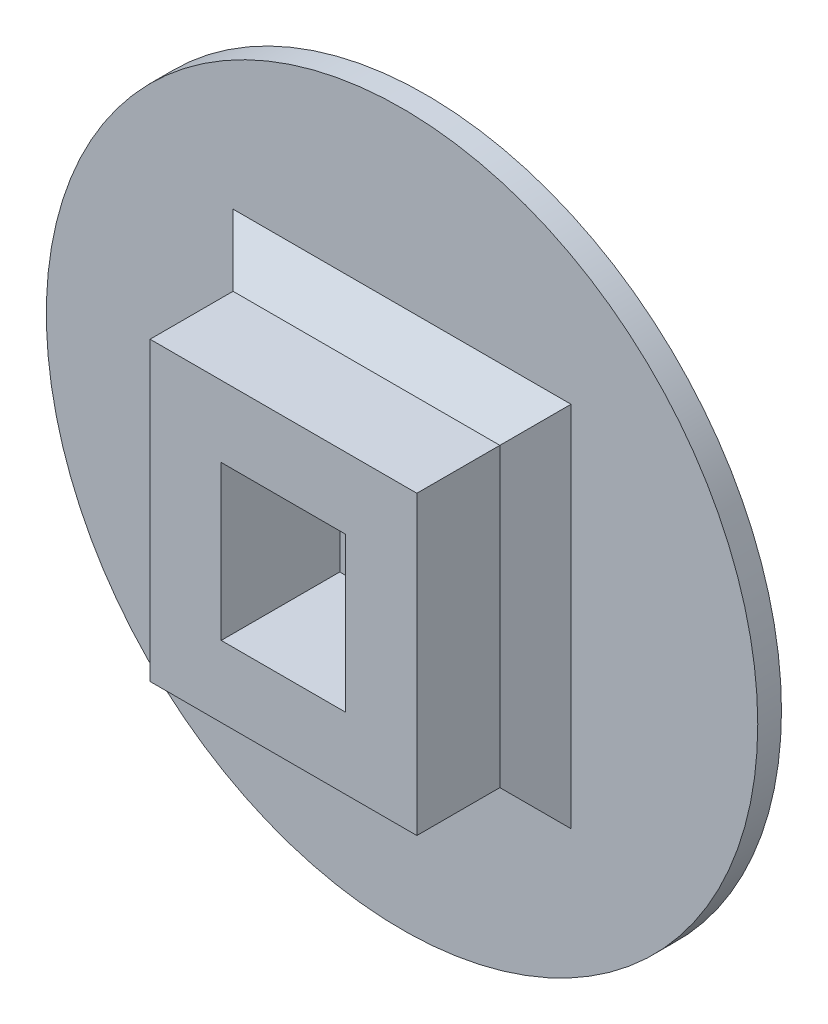
ISO-10303-21;
HEADER;
FILE_DESCRIPTION(('STEP AP214'),'2;1');
FILE_NAME('part.step','',(''),(''),'','','');
FILE_SCHEMA(('AUTOMOTIVE_DESIGN { 1 0 10303 214 1 1 1 1 }'));
ENDSEC;
DATA;
#1=APPLICATION_CONTEXT('core data for automotive mechanical design processes');
#2=APPLICATION_PROTOCOL_DEFINITION('international standard','automotive_design',2000,#1);
#3=PRODUCT_CONTEXT('',#1,'mechanical');
#4=PRODUCT('Part','Part','',(#3));
#5=PRODUCT_RELATED_PRODUCT_CATEGORY('part','',(#4));
#6=PRODUCT_DEFINITION_FORMATION('','',#4);
#7=PRODUCT_DEFINITION_CONTEXT('part definition',#1,'design');
#8=PRODUCT_DEFINITION('design','',#6,#7);
#9=PRODUCT_DEFINITION_SHAPE('','',#8);
#10=(LENGTH_UNIT() NAMED_UNIT(*) SI_UNIT(.MILLI.,.METRE.));
#11=(NAMED_UNIT(*) PLANE_ANGLE_UNIT() SI_UNIT($,.RADIAN.));
#12=(NAMED_UNIT(*) SI_UNIT($,.STERADIAN.) SOLID_ANGLE_UNIT());
#13=UNCERTAINTY_MEASURE_WITH_UNIT(LENGTH_MEASURE(1.E-05),#10,'distance_accuracy_value','');
#14=(GEOMETRIC_REPRESENTATION_CONTEXT(3) GLOBAL_UNCERTAINTY_ASSIGNED_CONTEXT((#13)) GLOBAL_UNIT_ASSIGNED_CONTEXT((#10,
#11,#12)) REPRESENTATION_CONTEXT('',''));
#15=CARTESIAN_POINT('',(0.,0.,0.));
#16=DIRECTION('',(0.,0.,1.));
#17=DIRECTION('',(1.,0.,0.));
#18=AXIS2_PLACEMENT_3D('',#15,#16,#17);
#19=CARTESIAN_POINT('',(0.,0.,0.4));
#20=DIRECTION('',(0.,0.,1.));
#21=DIRECTION('',(1.,0.,0.));
#22=AXIS2_PLACEMENT_3D('',#19,#20,#21);
#23=PLANE('',#22);
#24=DIRECTION('',(0.,-1.,0.));
#25=VECTOR('',#24,1.);
#26=CARTESIAN_POINT('',(2.85,0.,0.4));
#27=LINE('',#26,#25);
#28=CARTESIAN_POINT('',(2.85,3.1,0.4));
#29=VERTEX_POINT('',#28);
#30=CARTESIAN_POINT('',(2.85,-3.1,0.4));
#31=VERTEX_POINT('',#30);
#32=EDGE_CURVE('E209',#29,#31,#27,.T.);
#33=ORIENTED_EDGE('',*,*,#32,.T.);
#34=DIRECTION('',(-1.,0.,0.));
#35=VECTOR('',#34,1.);
#36=CARTESIAN_POINT('',(0.,-3.1,0.4));
#37=LINE('',#36,#35);
#38=CARTESIAN_POINT('',(-2.85,-3.1,0.4));
#39=VERTEX_POINT('',#38);
#40=EDGE_CURVE('E213',#31,#39,#37,.T.);
#41=ORIENTED_EDGE('',*,*,#40,.T.);
#42=DIRECTION('',(0.,1.,0.));
#43=VECTOR('',#42,1.);
#44=CARTESIAN_POINT('',(-2.85,0.,0.4));
#45=LINE('',#44,#43);
#46=CARTESIAN_POINT('',(-2.85,3.1,0.4));
#47=VERTEX_POINT('',#46);
#48=EDGE_CURVE('E211',#39,#47,#45,.T.);
#49=ORIENTED_EDGE('',*,*,#48,.T.);
#50=DIRECTION('',(1.,0.,0.));
#51=VECTOR('',#50,1.);
#52=CARTESIAN_POINT('',(0.,3.1,0.4));
#53=LINE('',#52,#51);
#54=EDGE_CURVE('E207',#47,#29,#53,.T.);
#55=ORIENTED_EDGE('',*,*,#54,.T.);
#56=EDGE_LOOP('',(#33,#41,#49,#55));
#57=FACE_BOUND('',#56,.T.);
#58=CARTESIAN_POINT('',(0.,0.,0.4));
#59=DIRECTION('',(0.,0.,1.));
#60=DIRECTION('',(1.,0.,0.));
#61=AXIS2_PLACEMENT_3D('',#58,#59,#60);
#62=CIRCLE('',#61,6.);
#63=CARTESIAN_POINT('',(6.,0.,0.4));
#64=VERTEX_POINT('',#63);
#65=EDGE_CURVE('E199',#64,#64,#62,.T.);
#66=ORIENTED_EDGE('',*,*,#65,.T.);
#67=EDGE_LOOP('',(#66));
#68=FACE_BOUND('',#67,.T.);
#69=ADVANCED_FACE('F58',(#57,#68),#23,.T.);
#70=CARTESIAN_POINT('',(0.,0.,0.4));
#71=DIRECTION('',(0.,0.,-1.));
#72=DIRECTION('',(-1.,0.,0.));
#73=AXIS2_PLACEMENT_3D('',#70,#71,#72);
#74=CYLINDRICAL_SURFACE('',#73,6.);
#75=ORIENTED_EDGE('',*,*,#65,.F.);
#76=EDGE_LOOP('',(#75));
#77=FACE_BOUND('',#76,.T.);
#78=CARTESIAN_POINT('',(0.,0.,0.));
#79=DIRECTION('',(0.,0.,1.));
#80=DIRECTION('',(1.,0.,0.));
#81=AXIS2_PLACEMENT_3D('',#78,#79,#80);
#82=CIRCLE('',#81,6.);
#83=CARTESIAN_POINT('',(6.,0.,0.));
#84=VERTEX_POINT('',#83);
#85=EDGE_CURVE('E198',#84,#84,#82,.T.);
#86=ORIENTED_EDGE('',*,*,#85,.T.);
#87=EDGE_LOOP('',(#86));
#88=FACE_BOUND('',#87,.T.);
#89=ADVANCED_FACE('F265',(#77,#88),#74,.T.);
#90=CARTESIAN_POINT('',(0.,0.,9.1));
#91=DIRECTION('',(0.,0.,1.));
#92=DIRECTION('',(1.,0.,0.));
#93=AXIS2_PLACEMENT_3D('',#90,#91,#92);
#94=SPHERICAL_SURFACE('',#93,10.9);
#95=ORIENTED_EDGE('',*,*,#85,.F.);
#96=EDGE_LOOP('',(#95));
#97=FACE_BOUND('',#96,.T.);
#98=ADVANCED_FACE('F271',(#97),#94,.T.);
#99=CARTESIAN_POINT('',(0.,0.,2.4));
#100=DIRECTION('',(0.,0.,1.));
#101=DIRECTION('',(1.,0.,0.));
#102=AXIS2_PLACEMENT_3D('',#99,#100,#101);
#103=PLANE('',#102);
#104=DIRECTION('',(0.,1.,0.));
#105=VECTOR('',#104,1.);
#106=CARTESIAN_POINT('',(2.25,1.3,2.4));
#107=LINE('',#106,#105);
#108=CARTESIAN_POINT('',(2.25,-2.5,2.4));
#109=VERTEX_POINT('',#108);
#110=CARTESIAN_POINT('',(2.25,2.5,2.4));
#111=VERTEX_POINT('',#110);
#112=EDGE_CURVE('E158',#109,#111,#107,.T.);
#113=ORIENTED_EDGE('',*,*,#112,.T.);
#114=DIRECTION('',(-1.,0.,0.));
#115=VECTOR('',#114,1.);
#116=CARTESIAN_POINT('',(-1.05,2.5,2.4));
#117=LINE('',#116,#115);
#118=CARTESIAN_POINT('',(-2.25,2.5,2.4));
#119=VERTEX_POINT('',#118);
#120=EDGE_CURVE('E183',#111,#119,#117,.T.);
#121=ORIENTED_EDGE('',*,*,#120,.T.);
#122=DIRECTION('',(0.,-1.,0.));
#123=VECTOR('',#122,1.);
#124=CARTESIAN_POINT('',(-2.25,1.3,2.4));
#125=LINE('',#124,#123);
#126=CARTESIAN_POINT('',(-2.25,-2.5,2.4));
#127=VERTEX_POINT('',#126);
#128=EDGE_CURVE('E185',#119,#127,#125,.T.);
#129=ORIENTED_EDGE('',*,*,#128,.T.);
#130=DIRECTION('',(1.,0.,0.));
#131=VECTOR('',#130,1.);
#132=CARTESIAN_POINT('',(-1.05,-2.5,2.4));
#133=LINE('',#132,#131);
#134=EDGE_CURVE('E187',#127,#109,#133,.T.);
#135=ORIENTED_EDGE('',*,*,#134,.T.);
#136=EDGE_LOOP('',(#113,#121,#129,#135));
#137=FACE_BOUND('',#136,.T.);
#138=DIRECTION('',(-1.,0.,0.));
#139=VECTOR('',#138,1.);
#140=CARTESIAN_POINT('',(-1.05,1.3,2.4));
#141=LINE('',#140,#139);
#142=CARTESIAN_POINT('',(1.05,1.3,2.4));
#143=VERTEX_POINT('',#142);
#144=CARTESIAN_POINT('',(-1.05,1.3,2.4));
#145=VERTEX_POINT('',#144);
#146=EDGE_CURVE('E149',#143,#145,#141,.T.);
#147=ORIENTED_EDGE('',*,*,#146,.F.);
#148=DIRECTION('',(0.,1.,0.));
#149=VECTOR('',#148,1.);
#150=CARTESIAN_POINT('',(1.05,1.3,2.4));
#151=LINE('',#150,#149);
#152=CARTESIAN_POINT('',(1.05,-1.3,2.4));
#153=VERTEX_POINT('',#152);
#154=EDGE_CURVE('E139',#153,#143,#151,.T.);
#155=ORIENTED_EDGE('',*,*,#154,.F.);
#156=DIRECTION('',(1.,0.,0.));
#157=VECTOR('',#156,1.);
#158=CARTESIAN_POINT('',(-1.05,-1.3,2.4));
#159=LINE('',#158,#157);
#160=CARTESIAN_POINT('',(-1.05,-1.3,2.4));
#161=VERTEX_POINT('',#160);
#162=EDGE_CURVE('E166',#161,#153,#159,.T.);
#163=ORIENTED_EDGE('',*,*,#162,.F.);
#164=DIRECTION('',(0.,-1.,0.));
#165=VECTOR('',#164,1.);
#166=CARTESIAN_POINT('',(-1.05,1.3,2.4));
#167=LINE('',#166,#165);
#168=EDGE_CURVE('E164',#145,#161,#167,.T.);
#169=ORIENTED_EDGE('',*,*,#168,.F.);
#170=EDGE_LOOP('',(#147,#155,#163,#169));
#171=FACE_BOUND('',#170,.T.);
#172=ADVANCED_FACE('F162',(#137,#171),#103,.T.);
#173=CARTESIAN_POINT('',(2.25,1.3,2.4));
#174=DIRECTION('',(-1.,0.,0.));
#175=DIRECTION('',(0.,-1.,0.));
#176=AXIS2_PLACEMENT_3D('',#173,#174,#175);
#177=PLANE('',#176);
#178=DIRECTION('',(0.,0.,-1.));
#179=VECTOR('',#178,1.);
#180=CARTESIAN_POINT('',(2.25,-2.5,2.4));
#181=LINE('',#180,#179);
#182=CARTESIAN_POINT('',(2.25,-2.5,1.));
#183=VERTEX_POINT('',#182);
#184=EDGE_CURVE('E189',#109,#183,#181,.T.);
#185=ORIENTED_EDGE('',*,*,#184,.T.);
#186=DIRECTION('',(0.,1.,0.));
#187=VECTOR('',#186,1.);
#188=CARTESIAN_POINT('',(2.25,1.3,1.));
#189=LINE('',#188,#187);
#190=CARTESIAN_POINT('',(2.25,2.5,1.));
#191=VERTEX_POINT('',#190);
#192=EDGE_CURVE('E68',#183,#191,#189,.T.);
#193=ORIENTED_EDGE('',*,*,#192,.T.);
#194=DIRECTION('',(0.,0.,-1.));
#195=VECTOR('',#194,1.);
#196=CARTESIAN_POINT('',(2.25,2.5,2.4));
#197=LINE('',#196,#195);
#198=EDGE_CURVE('E196',#111,#191,#197,.T.);
#199=ORIENTED_EDGE('',*,*,#198,.F.);
#200=ORIENTED_EDGE('',*,*,#112,.F.);
#201=EDGE_LOOP('',(#185,#193,#199,#200));
#202=FACE_BOUND('',#201,.T.);
#203=ADVANCED_FACE('F250',(#202),#177,.F.);
#204=CARTESIAN_POINT('',(-1.05,2.5,2.4));
#205=DIRECTION('',(0.,-1.,0.));
#206=DIRECTION('',(0.,0.,-1.));
#207=AXIS2_PLACEMENT_3D('',#204,#205,#206);
#208=PLANE('',#207);
#209=ORIENTED_EDGE('',*,*,#198,.T.);
#210=DIRECTION('',(-1.,0.,0.));
#211=VECTOR('',#210,1.);
#212=CARTESIAN_POINT('',(-1.05,2.5,1.));
#213=LINE('',#212,#211);
#214=CARTESIAN_POINT('',(-2.25,2.5,1.));
#215=VERTEX_POINT('',#214);
#216=EDGE_CURVE('E12',#191,#215,#213,.T.);
#217=ORIENTED_EDGE('',*,*,#216,.T.);
#218=DIRECTION('',(0.,0.,-1.));
#219=VECTOR('',#218,1.);
#220=CARTESIAN_POINT('',(-2.25,2.5,2.4));
#221=LINE('',#220,#219);
#222=EDGE_CURVE('E194',#119,#215,#221,.T.);
#223=ORIENTED_EDGE('',*,*,#222,.F.);
#224=ORIENTED_EDGE('',*,*,#120,.F.);
#225=EDGE_LOOP('',(#209,#217,#223,#224));
#226=FACE_BOUND('',#225,.T.);
#227=ADVANCED_FACE('F255',(#226),#208,.F.);
#228=CARTESIAN_POINT('',(-2.25,1.3,2.4));
#229=DIRECTION('',(1.,0.,0.));
#230=DIRECTION('',(0.,1.,0.));
#231=AXIS2_PLACEMENT_3D('',#228,#229,#230);
#232=PLANE('',#231);
#233=ORIENTED_EDGE('',*,*,#222,.T.);
#234=DIRECTION('',(0.,-1.,0.));
#235=VECTOR('',#234,1.);
#236=CARTESIAN_POINT('',(-2.25,1.3,1.));
#237=LINE('',#236,#235);
#238=CARTESIAN_POINT('',(-2.25,-2.5,1.));
#239=VERTEX_POINT('',#238);
#240=EDGE_CURVE('E216',#215,#239,#237,.T.);
#241=ORIENTED_EDGE('',*,*,#240,.T.);
#242=DIRECTION('',(0.,0.,-1.));
#243=VECTOR('',#242,1.);
#244=CARTESIAN_POINT('',(-2.25,-2.5,2.4));
#245=LINE('',#244,#243);
#246=EDGE_CURVE('E191',#127,#239,#245,.T.);
#247=ORIENTED_EDGE('',*,*,#246,.F.);
#248=ORIENTED_EDGE('',*,*,#128,.F.);
#249=EDGE_LOOP('',(#233,#241,#247,#248));
#250=FACE_BOUND('',#249,.T.);
#251=ADVANCED_FACE('F254',(#250),#232,.F.);
#252=CARTESIAN_POINT('',(-1.05,-2.5,2.4));
#253=DIRECTION('',(0.,1.,0.));
#254=DIRECTION('',(0.,0.,1.));
#255=AXIS2_PLACEMENT_3D('',#252,#253,#254);
#256=PLANE('',#255);
#257=ORIENTED_EDGE('',*,*,#246,.T.);
#258=DIRECTION('',(1.,0.,0.));
#259=VECTOR('',#258,1.);
#260=CARTESIAN_POINT('',(-1.05,-2.5,1.));
#261=LINE('',#260,#259);
#262=EDGE_CURVE('E202',#239,#183,#261,.T.);
#263=ORIENTED_EDGE('',*,*,#262,.T.);
#264=ORIENTED_EDGE('',*,*,#184,.F.);
#265=ORIENTED_EDGE('',*,*,#134,.F.);
#266=EDGE_LOOP('',(#257,#263,#264,#265));
#267=FACE_BOUND('',#266,.T.);
#268=ADVANCED_FACE('F246',(#267),#256,.F.);
#269=CARTESIAN_POINT('',(1.05,1.3,2.4));
#270=DIRECTION('',(-1.,0.,0.));
#271=DIRECTION('',(0.,-1.,0.));
#272=AXIS2_PLACEMENT_3D('',#269,#270,#271);
#273=PLANE('',#272);
#274=DIRECTION('',(0.,1.,0.));
#275=VECTOR('',#274,1.);
#276=CARTESIAN_POINT('',(1.05,1.3,0.4));
#277=LINE('',#276,#275);
#278=CARTESIAN_POINT('',(1.05,-1.3,0.4));
#279=VERTEX_POINT('',#278);
#280=CARTESIAN_POINT('',(1.05,1.3,0.4));
#281=VERTEX_POINT('',#280);
#282=EDGE_CURVE('E170',#279,#281,#277,.T.);
#283=ORIENTED_EDGE('',*,*,#282,.F.);
#284=DIRECTION('',(0.,0.,-1.));
#285=VECTOR('',#284,1.);
#286=CARTESIAN_POINT('',(1.05,-1.3,2.4));
#287=LINE('',#286,#285);
#288=EDGE_CURVE('E145',#153,#279,#287,.T.);
#289=ORIENTED_EDGE('',*,*,#288,.F.);
#290=ORIENTED_EDGE('',*,*,#154,.T.);
#291=DIRECTION('',(0.,0.,-1.));
#292=VECTOR('',#291,1.);
#293=CARTESIAN_POINT('',(1.05,1.3,2.4));
#294=LINE('',#293,#292);
#295=EDGE_CURVE('E143',#143,#281,#294,.T.);
#296=ORIENTED_EDGE('',*,*,#295,.T.);
#297=EDGE_LOOP('',(#283,#289,#290,#296));
#298=FACE_BOUND('',#297,.T.);
#299=ADVANCED_FACE('F142',(#298),#273,.T.);
#300=CARTESIAN_POINT('',(-1.05,1.3,2.4));
#301=DIRECTION('',(0.,-1.,0.));
#302=DIRECTION('',(0.,0.,-1.));
#303=AXIS2_PLACEMENT_3D('',#300,#301,#302);
#304=PLANE('',#303);
#305=DIRECTION('',(-1.,0.,0.));
#306=VECTOR('',#305,1.);
#307=CARTESIAN_POINT('',(-1.05,1.3,0.4));
#308=LINE('',#307,#306);
#309=CARTESIAN_POINT('',(-1.05,1.3,0.4));
#310=VERTEX_POINT('',#309);
#311=EDGE_CURVE('E157',#281,#310,#308,.T.);
#312=ORIENTED_EDGE('',*,*,#311,.F.);
#313=ORIENTED_EDGE('',*,*,#295,.F.);
#314=ORIENTED_EDGE('',*,*,#146,.T.);
#315=DIRECTION('',(0.,0.,-1.));
#316=VECTOR('',#315,1.);
#317=CARTESIAN_POINT('',(-1.05,1.3,2.4));
#318=LINE('',#317,#316);
#319=EDGE_CURVE('E159',#145,#310,#318,.T.);
#320=ORIENTED_EDGE('',*,*,#319,.T.);
#321=EDGE_LOOP('',(#312,#313,#314,#320));
#322=FACE_BOUND('',#321,.T.);
#323=ADVANCED_FACE('F154',(#322),#304,.T.);
#324=CARTESIAN_POINT('',(-1.05,1.3,2.4));
#325=DIRECTION('',(1.,0.,0.));
#326=DIRECTION('',(0.,1.,0.));
#327=AXIS2_PLACEMENT_3D('',#324,#325,#326);
#328=PLANE('',#327);
#329=DIRECTION('',(0.,-1.,0.));
#330=VECTOR('',#329,1.);
#331=CARTESIAN_POINT('',(-1.05,1.3,0.4));
#332=LINE('',#331,#330);
#333=CARTESIAN_POINT('',(-1.05,-1.3,0.4));
#334=VERTEX_POINT('',#333);
#335=EDGE_CURVE('E173',#310,#334,#332,.T.);
#336=ORIENTED_EDGE('',*,*,#335,.F.);
#337=ORIENTED_EDGE('',*,*,#319,.F.);
#338=ORIENTED_EDGE('',*,*,#168,.T.);
#339=DIRECTION('',(0.,0.,-1.));
#340=VECTOR('',#339,1.);
#341=CARTESIAN_POINT('',(-1.05,-1.3,2.4));
#342=LINE('',#341,#340);
#343=EDGE_CURVE('E177',#161,#334,#342,.T.);
#344=ORIENTED_EDGE('',*,*,#343,.T.);
#345=EDGE_LOOP('',(#336,#337,#338,#344));
#346=FACE_BOUND('',#345,.T.);
#347=ADVANCED_FACE('F281',(#346),#328,.T.);
#348=CARTESIAN_POINT('',(-1.05,-1.3,2.4));
#349=DIRECTION('',(0.,1.,0.));
#350=DIRECTION('',(0.,0.,1.));
#351=AXIS2_PLACEMENT_3D('',#348,#349,#350);
#352=PLANE('',#351);
#353=DIRECTION('',(1.,0.,0.));
#354=VECTOR('',#353,1.);
#355=CARTESIAN_POINT('',(-1.05,-1.3,0.4));
#356=LINE('',#355,#354);
#357=EDGE_CURVE('E150',#334,#279,#356,.T.);
#358=ORIENTED_EDGE('',*,*,#357,.F.);
#359=ORIENTED_EDGE('',*,*,#343,.F.);
#360=ORIENTED_EDGE('',*,*,#162,.T.);
#361=ORIENTED_EDGE('',*,*,#288,.T.);
#362=EDGE_LOOP('',(#358,#359,#360,#361));
#363=FACE_BOUND('',#362,.T.);
#364=ADVANCED_FACE('F275',(#363),#352,.T.);
#365=ORIENTED_EDGE('',*,*,#282,.T.);
#366=ORIENTED_EDGE('',*,*,#311,.T.);
#367=ORIENTED_EDGE('',*,*,#335,.T.);
#368=ORIENTED_EDGE('',*,*,#357,.T.);
#369=EDGE_LOOP('',(#365,#366,#367,#368));
#370=FACE_BOUND('',#369,.T.);
#371=ADVANCED_FACE('F267',(#370),#23,.T.);
#372=CARTESIAN_POINT('',(-1.05,2.5,1.));
#373=DIRECTION('',(0.,-0.707106781186551,-0.707106781186544));
#374=DIRECTION('',(-1.,0.,0.));
#375=AXIS2_PLACEMENT_3D('',#372,#373,#374);
#376=PLANE('',#375);
#377=DIRECTION('',(0.577350269189624,0.577350269189624,-0.577350269189629));
#378=VECTOR('',#377,1.);
#379=CARTESIAN_POINT('',(1.15000000000001,1.40000000000001,2.10000000000001));
#380=LINE('',#379,#378);
#381=EDGE_CURVE('E222',#29,#191,#380,.F.);
#382=ORIENTED_EDGE('',*,*,#381,.F.);
#383=ORIENTED_EDGE('',*,*,#54,.F.);
#384=DIRECTION('',(0.577350269189624,-0.577350269189624,0.577350269189629));
#385=VECTOR('',#384,1.);
#386=CARTESIAN_POINT('',(-1.85,2.1,1.4));
#387=LINE('',#386,#385);
#388=EDGE_CURVE('E63',#215,#47,#387,.F.);
#389=ORIENTED_EDGE('',*,*,#388,.F.);
#390=ORIENTED_EDGE('',*,*,#216,.F.);
#391=EDGE_LOOP('',(#382,#383,#389,#390));
#392=FACE_BOUND('',#391,.T.);
#393=ADVANCED_FACE('F61',(#392),#376,.F.);
#394=CARTESIAN_POINT('',(-2.25,1.3,1.));
#395=DIRECTION('',(0.70710678118655,0.,-0.707106781186544));
#396=DIRECTION('',(0.,-1.,0.));
#397=AXIS2_PLACEMENT_3D('',#394,#395,#396);
#398=PLANE('',#397);
#399=ORIENTED_EDGE('',*,*,#388,.T.);
#400=ORIENTED_EDGE('',*,*,#48,.F.);
#401=DIRECTION('',(0.577350269189624,0.577350269189624,0.577350269189629));
#402=VECTOR('',#401,1.);
#403=CARTESIAN_POINT('',(-0.983333333333341,-1.23333333333334,2.26666666666667));
#404=LINE('',#403,#402);
#405=EDGE_CURVE('E221',#239,#39,#404,.F.);
#406=ORIENTED_EDGE('',*,*,#405,.F.);
#407=ORIENTED_EDGE('',*,*,#240,.F.);
#408=EDGE_LOOP('',(#399,#400,#406,#407));
#409=FACE_BOUND('',#408,.T.);
#410=ADVANCED_FACE('F232',(#409),#398,.F.);
#411=CARTESIAN_POINT('',(2.25,1.3,1.));
#412=DIRECTION('',(-0.707106781186551,0.,-0.707106781186544));
#413=DIRECTION('',(0.,1.,0.));
#414=AXIS2_PLACEMENT_3D('',#411,#412,#413);
#415=PLANE('',#414);
#416=ORIENTED_EDGE('',*,*,#381,.T.);
#417=ORIENTED_EDGE('',*,*,#192,.F.);
#418=DIRECTION('',(0.577350269189624,-0.577350269189624,-0.577350269189629));
#419=VECTOR('',#418,1.);
#420=CARTESIAN_POINT('',(0.983333333333341,-1.23333333333334,2.26666666666667));
#421=LINE('',#420,#419);
#422=EDGE_CURVE('E219',#31,#183,#421,.F.);
#423=ORIENTED_EDGE('',*,*,#422,.F.);
#424=ORIENTED_EDGE('',*,*,#32,.F.);
#425=EDGE_LOOP('',(#416,#417,#423,#424));
#426=FACE_BOUND('',#425,.T.);
#427=ADVANCED_FACE('F243',(#426),#415,.F.);
#428=CARTESIAN_POINT('',(-1.05,-2.5,1.));
#429=DIRECTION('',(0.,0.707106781186551,-0.707106781186544));
#430=DIRECTION('',(1.,0.,0.));
#431=AXIS2_PLACEMENT_3D('',#428,#429,#430);
#432=PLANE('',#431);
#433=ORIENTED_EDGE('',*,*,#405,.T.);
#434=ORIENTED_EDGE('',*,*,#40,.F.);
#435=ORIENTED_EDGE('',*,*,#422,.T.);
#436=ORIENTED_EDGE('',*,*,#262,.F.);
#437=EDGE_LOOP('',(#433,#434,#435,#436));
#438=FACE_BOUND('',#437,.T.);
#439=ADVANCED_FACE('F241',(#438),#432,.F.);
#440=CLOSED_SHELL('',(#69,#89,#98,#172,#203,#227,#251,#268,#299,#323,#347,#364,#371,#393,#410,
#427,#439));
#441=MANIFOLD_SOLID_BREP('B2',#440);
#442=ADVANCED_BREP_SHAPE_REPRESENTATION('',(#18,#441),#14);
#443=SHAPE_DEFINITION_REPRESENTATION(#9,#442);
ENDSEC;
END-ISO-10303-21;
